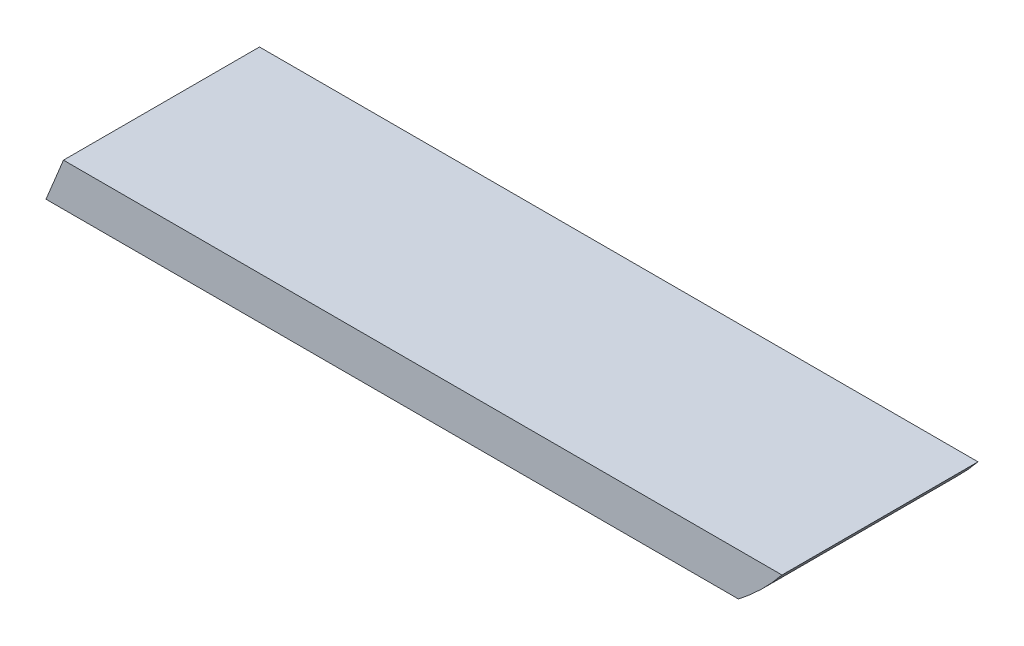
ISO-10303-21;
HEADER;
FILE_DESCRIPTION(('STEP AP214'),'2;1');
FILE_NAME('part.step','',(''),(''),'','','');
FILE_SCHEMA(('AUTOMOTIVE_DESIGN { 1 0 10303 214 1 1 1 1 }'));
ENDSEC;
DATA;
#1=APPLICATION_CONTEXT('core data for automotive mechanical design processes');
#2=APPLICATION_PROTOCOL_DEFINITION('international standard','automotive_design',2000,#1);
#3=PRODUCT_CONTEXT('',#1,'mechanical');
#4=PRODUCT('Part','Part','',(#3));
#5=PRODUCT_RELATED_PRODUCT_CATEGORY('part','',(#4));
#6=PRODUCT_DEFINITION_FORMATION('','',#4);
#7=PRODUCT_DEFINITION_CONTEXT('part definition',#1,'design');
#8=PRODUCT_DEFINITION('design','',#6,#7);
#9=PRODUCT_DEFINITION_SHAPE('','',#8);
#10=(LENGTH_UNIT() NAMED_UNIT(*) SI_UNIT(.MILLI.,.METRE.));
#11=(NAMED_UNIT(*) PLANE_ANGLE_UNIT() SI_UNIT($,.RADIAN.));
#12=(NAMED_UNIT(*) SI_UNIT($,.STERADIAN.) SOLID_ANGLE_UNIT());
#13=UNCERTAINTY_MEASURE_WITH_UNIT(LENGTH_MEASURE(1.E-05),#10,'distance_accuracy_value','');
#14=(GEOMETRIC_REPRESENTATION_CONTEXT(3) GLOBAL_UNCERTAINTY_ASSIGNED_CONTEXT((#13)) GLOBAL_UNIT_ASSIGNED_CONTEXT((#10,
#11,#12)) REPRESENTATION_CONTEXT('',''));
#15=CARTESIAN_POINT('',(0.,0.,0.));
#16=DIRECTION('',(0.,0.,1.));
#17=DIRECTION('',(1.,0.,0.));
#18=AXIS2_PLACEMENT_3D('',#15,#16,#17);
#19=CARTESIAN_POINT('',(-26.474240487687,6.005899301844,0.));
#20=DIRECTION('',(0.,0.,1.));
#21=DIRECTION('',(0.611622808019457,-0.791149505915535,0.));
#22=AXIS2_PLACEMENT_3D('',#19,#20,#21);
#23=CYLINDRICAL_SURFACE('',#22,0.133821831316658);
#24=CARTESIAN_POINT('',(-26.474240487687,6.005899301844,0.));
#25=DIRECTION('',(0.,0.,1.));
#26=DIRECTION('',(0.611622808019457,-0.791149505915535,0.));
#27=AXIS2_PLACEMENT_3D('',#24,#25,#26);
#28=CIRCLE('',#27,0.133821831316658);
#29=CARTESIAN_POINT('',(-26.392392003442,5.900026226117,0.));
#30=VERTEX_POINT('',#29);
#31=CARTESIAN_POINT('',(-26.370182426594,5.921755362914,0.));
#32=VERTEX_POINT('',#31);
#33=EDGE_CURVE('E11',#30,#32,#28,.T.);
#34=ORIENTED_EDGE('',*,*,#33,.T.);
#35=DIRECTION('',(0.,0.,1.));
#36=VECTOR('',#35,1.);
#37=CARTESIAN_POINT('',(-26.370182426594,5.921755362914,0.));
#38=LINE('',#37,#36);
#39=CARTESIAN_POINT('',(-26.370182426594,5.921755362914,0.1));
#40=VERTEX_POINT('',#39);
#41=EDGE_CURVE('E24',#32,#40,#38,.T.);
#42=ORIENTED_EDGE('',*,*,#41,.T.);
#43=CARTESIAN_POINT('',(-26.474240487687,6.005899301844,0.1));
#44=DIRECTION('',(0.,0.,1.));
#45=DIRECTION('',(0.611622808019457,-0.791149505915535,0.));
#46=AXIS2_PLACEMENT_3D('',#43,#44,#45);
#47=CIRCLE('',#46,0.133821831316658);
#48=CARTESIAN_POINT('',(-26.392392003442,5.900026226117,0.1));
#49=VERTEX_POINT('',#48);
#50=EDGE_CURVE('E75',#49,#40,#47,.T.);
#51=ORIENTED_EDGE('',*,*,#50,.F.);
#52=DIRECTION('',(0.,0.,1.));
#53=VECTOR('',#52,1.);
#54=CARTESIAN_POINT('',(-26.392392003442,5.900026226117,0.));
#55=LINE('',#54,#53);
#56=EDGE_CURVE('E86',#30,#49,#55,.T.);
#57=ORIENTED_EDGE('',*,*,#56,.F.);
#58=EDGE_LOOP('',(#34,#42,#51,#57));
#59=FACE_BOUND('',#58,.T.);
#60=ADVANCED_FACE('F17',(#59),#23,.T.);
#61=CARTESIAN_POINT('',(-26.745673863956,5.900026226117,0.));
#62=DIRECTION('',(0.,-1.,0.));
#63=DIRECTION('',(1.,0.,0.));
#64=AXIS2_PLACEMENT_3D('',#61,#62,#63);
#65=PLANE('',#64);
#66=DIRECTION('',(1.,0.,0.));
#67=VECTOR('',#66,1.);
#68=CARTESIAN_POINT('',(-26.745673863956,5.900026226117,0.));
#69=LINE('',#68,#67);
#70=CARTESIAN_POINT('',(-26.745673863956,5.900026226117,0.));
#71=VERTEX_POINT('',#70);
#72=EDGE_CURVE('E83',#71,#30,#69,.T.);
#73=ORIENTED_EDGE('',*,*,#72,.T.);
#74=ORIENTED_EDGE('',*,*,#56,.T.);
#75=DIRECTION('',(1.,0.,0.));
#76=VECTOR('',#75,1.);
#77=CARTESIAN_POINT('',(-26.745673863956,5.900026226117,0.1));
#78=LINE('',#77,#76);
#79=CARTESIAN_POINT('',(-26.745673863956,5.900026226117,0.1));
#80=VERTEX_POINT('',#79);
#81=EDGE_CURVE('E81',#80,#49,#78,.T.);
#82=ORIENTED_EDGE('',*,*,#81,.F.);
#83=DIRECTION('',(0.,0.,1.));
#84=VECTOR('',#83,1.);
#85=CARTESIAN_POINT('',(-26.745673863956,5.900026226117,0.));
#86=LINE('',#85,#84);
#87=EDGE_CURVE('E61',#71,#80,#86,.T.);
#88=ORIENTED_EDGE('',*,*,#87,.F.);
#89=EDGE_LOOP('',(#73,#74,#82,#88));
#90=FACE_BOUND('',#89,.T.);
#91=ADVANCED_FACE('F91',(#90),#65,.T.);
#92=CARTESIAN_POINT('',(-26.736766596962,5.921755362914,0.));
#93=DIRECTION('',(-0.925276999373028,0.379292070087479,0.));
#94=DIRECTION('',(-0.379292070087479,-0.925276999373028,0.));
#95=AXIS2_PLACEMENT_3D('',#92,#93,#94);
#96=PLANE('',#95);
#97=DIRECTION('',(-0.379292070087479,-0.925276999373028,0.));
#98=VECTOR('',#97,1.);
#99=CARTESIAN_POINT('',(-26.736766596962,5.921755362914,0.));
#100=LINE('',#99,#98);
#101=CARTESIAN_POINT('',(-26.736766596962,5.921755362914,0.));
#102=VERTEX_POINT('',#101);
#103=EDGE_CURVE('E65',#102,#71,#100,.T.);
#104=ORIENTED_EDGE('',*,*,#103,.T.);
#105=ORIENTED_EDGE('',*,*,#87,.T.);
#106=DIRECTION('',(-0.379292070087479,-0.925276999373028,0.));
#107=VECTOR('',#106,1.);
#108=CARTESIAN_POINT('',(-26.736766596962,5.921755362914,0.1));
#109=LINE('',#108,#107);
#110=CARTESIAN_POINT('',(-26.736766596962,5.921755362914,0.1));
#111=VERTEX_POINT('',#110);
#112=EDGE_CURVE('E54',#111,#80,#109,.T.);
#113=ORIENTED_EDGE('',*,*,#112,.F.);
#114=DIRECTION('',(0.,0.,1.));
#115=VECTOR('',#114,1.);
#116=CARTESIAN_POINT('',(-26.736766596962,5.921755362914,0.));
#117=LINE('',#116,#115);
#118=EDGE_CURVE('E58',#102,#111,#117,.T.);
#119=ORIENTED_EDGE('',*,*,#118,.F.);
#120=EDGE_LOOP('',(#104,#105,#113,#119));
#121=FACE_BOUND('',#120,.T.);
#122=ADVANCED_FACE('F57',(#121),#96,.T.);
#123=CARTESIAN_POINT('',(-26.370182426594,5.921755362914,0.));
#124=DIRECTION('',(0.,1.,0.));
#125=DIRECTION('',(-1.,0.,0.));
#126=AXIS2_PLACEMENT_3D('',#123,#124,#125);
#127=PLANE('',#126);
#128=DIRECTION('',(-1.,0.,0.));
#129=VECTOR('',#128,1.);
#130=CARTESIAN_POINT('',(-26.370182426594,5.921755362914,0.));
#131=LINE('',#130,#129);
#132=EDGE_CURVE('E71',#32,#102,#131,.T.);
#133=ORIENTED_EDGE('',*,*,#132,.T.);
#134=ORIENTED_EDGE('',*,*,#118,.T.);
#135=DIRECTION('',(-1.,0.,0.));
#136=VECTOR('',#135,1.);
#137=CARTESIAN_POINT('',(-26.370182426594,5.921755362914,0.1));
#138=LINE('',#137,#136);
#139=EDGE_CURVE('E70',#40,#111,#138,.T.);
#140=ORIENTED_EDGE('',*,*,#139,.F.);
#141=ORIENTED_EDGE('',*,*,#41,.F.);
#142=EDGE_LOOP('',(#133,#134,#140,#141));
#143=FACE_BOUND('',#142,.T.);
#144=ADVANCED_FACE('F69',(#143),#127,.T.);
#145=CARTESIAN_POINT('',(-26.561135914922,5.911066162103,0.1));
#146=DIRECTION('',(0.,0.,1.));
#147=DIRECTION('',(1.,0.,0.));
#148=AXIS2_PLACEMENT_3D('',#145,#146,#147);
#149=PLANE('',#148);
#150=ORIENTED_EDGE('',*,*,#139,.T.);
#151=ORIENTED_EDGE('',*,*,#112,.T.);
#152=ORIENTED_EDGE('',*,*,#81,.T.);
#153=ORIENTED_EDGE('',*,*,#50,.T.);
#154=EDGE_LOOP('',(#150,#151,#152,#153));
#155=FACE_BOUND('',#154,.T.);
#156=ADVANCED_FACE('F74',(#155),#149,.T.);
#157=CARTESIAN_POINT('',(-26.561135914922,5.911066162103,0.));
#158=DIRECTION('',(0.,0.,1.));
#159=DIRECTION('',(1.,0.,0.));
#160=AXIS2_PLACEMENT_3D('',#157,#158,#159);
#161=PLANE('',#160);
#162=ORIENTED_EDGE('',*,*,#132,.F.);
#163=ORIENTED_EDGE('',*,*,#33,.F.);
#164=ORIENTED_EDGE('',*,*,#72,.F.);
#165=ORIENTED_EDGE('',*,*,#103,.F.);
#166=EDGE_LOOP('',(#162,#163,#164,#165));
#167=FACE_BOUND('',#166,.T.);
#168=ADVANCED_FACE('F89',(#167),#161,.F.);
#169=CLOSED_SHELL('',(#60,#91,#122,#144,#156,#168));
#170=MANIFOLD_SOLID_BREP('B1',#169);
#171=ADVANCED_BREP_SHAPE_REPRESENTATION('',(#18,#170),#14);
#172=SHAPE_DEFINITION_REPRESENTATION(#9,#171);
ENDSEC;
END-ISO-10303-21;
